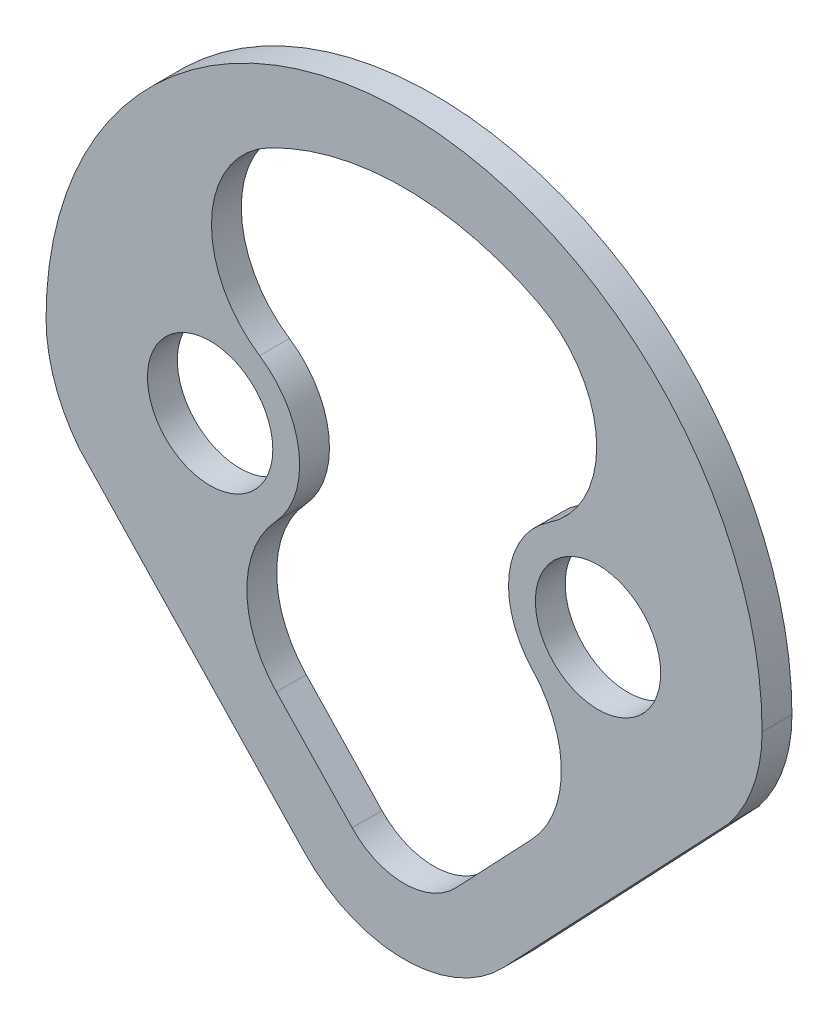
ISO-10303-21;
HEADER;
FILE_DESCRIPTION(('STEP AP214'),'2;1');
FILE_NAME('part.step','',(''),(''),'','','');
FILE_SCHEMA(('AUTOMOTIVE_DESIGN { 1 0 10303 214 1 1 1 1 }'));
ENDSEC;
DATA;
#1=APPLICATION_CONTEXT('core data for automotive mechanical design processes');
#2=APPLICATION_PROTOCOL_DEFINITION('international standard','automotive_design',2000,#1);
#3=PRODUCT_CONTEXT('',#1,'mechanical');
#4=PRODUCT('Part','Part','',(#3));
#5=PRODUCT_RELATED_PRODUCT_CATEGORY('part','',(#4));
#6=PRODUCT_DEFINITION_FORMATION('','',#4);
#7=PRODUCT_DEFINITION_CONTEXT('part definition',#1,'design');
#8=PRODUCT_DEFINITION('design','',#6,#7);
#9=PRODUCT_DEFINITION_SHAPE('','',#8);
#10=(LENGTH_UNIT() NAMED_UNIT(*) SI_UNIT(.MILLI.,.METRE.));
#11=(NAMED_UNIT(*) PLANE_ANGLE_UNIT() SI_UNIT($,.RADIAN.));
#12=(NAMED_UNIT(*) SI_UNIT($,.STERADIAN.) SOLID_ANGLE_UNIT());
#13=UNCERTAINTY_MEASURE_WITH_UNIT(LENGTH_MEASURE(1.E-05),#10,'distance_accuracy_value','');
#14=(GEOMETRIC_REPRESENTATION_CONTEXT(3) GLOBAL_UNCERTAINTY_ASSIGNED_CONTEXT((#13)) GLOBAL_UNIT_ASSIGNED_CONTEXT((#10,
#11,#12)) REPRESENTATION_CONTEXT('',''));
#15=CARTESIAN_POINT('',(0.,0.,0.));
#16=DIRECTION('',(0.,0.,1.));
#17=DIRECTION('',(1.,0.,0.));
#18=AXIS2_PLACEMENT_3D('',#15,#16,#17);
#19=CARTESIAN_POINT('',(14.2807692307692,67.5147166108887,5.));
#20=DIRECTION('',(0.,0.,-1.));
#21=DIRECTION('',(-1.,0.,0.));
#22=AXIS2_PLACEMENT_3D('',#19,#20,#21);
#23=CYLINDRICAL_SURFACE('',#22,18.);
#24=CARTESIAN_POINT('',(14.2807692307692,67.5147166108887,0.));
#25=DIRECTION('',(0.,0.,1.));
#26=DIRECTION('',(1.,0.,0.));
#27=AXIS2_PLACEMENT_3D('',#24,#25,#26);
#28=CIRCLE('',#27,18.);
#29=CARTESIAN_POINT('',(24.2185314685314,52.5066893685858,0.));
#30=VERTEX_POINT('',#29);
#31=CARTESIAN_POINT('',(22.5728287841191,83.4910036752757,0.));
#32=VERTEX_POINT('',#31);
#33=EDGE_CURVE('E254',#30,#32,#28,.T.);
#34=ORIENTED_EDGE('',*,*,#33,.F.);
#35=DIRECTION('',(0.,0.,-1.));
#36=VECTOR('',#35,1.);
#37=CARTESIAN_POINT('',(24.2185314685314,52.5066893685858,5.));
#38=LINE('',#37,#36);
#39=CARTESIAN_POINT('',(24.2185314685314,52.5066893685858,5.));
#40=VERTEX_POINT('',#39);
#41=EDGE_CURVE('E11',#40,#30,#38,.T.);
#42=ORIENTED_EDGE('',*,*,#41,.F.);
#43=CARTESIAN_POINT('',(14.2807692307692,67.5147166108887,5.));
#44=DIRECTION('',(0.,0.,1.));
#45=DIRECTION('',(1.,0.,0.));
#46=AXIS2_PLACEMENT_3D('',#43,#44,#45);
#47=CIRCLE('',#46,18.);
#48=CARTESIAN_POINT('',(22.5728287841191,83.4910036752757,5.));
#49=VERTEX_POINT('',#48);
#50=EDGE_CURVE('E288',#40,#49,#47,.T.);
#51=ORIENTED_EDGE('',*,*,#50,.T.);
#52=DIRECTION('',(0.,0.,-1.));
#53=VECTOR('',#52,1.);
#54=CARTESIAN_POINT('',(22.5728287841191,83.4910036752757,5.));
#55=LINE('',#54,#53);
#56=EDGE_CURVE('E64',#49,#32,#55,.T.);
#57=ORIENTED_EDGE('',*,*,#56,.T.);
#58=EDGE_LOOP('',(#34,#42,#51,#57));
#59=FACE_BOUND('',#58,.T.);
#60=ADVANCED_FACE('F43',(#59),#23,.F.);
#61=CARTESIAN_POINT('',(32.5,40.,5.));
#62=DIRECTION('',(0.,0.,-1.));
#63=DIRECTION('',(-1.,0.,0.));
#64=AXIS2_PLACEMENT_3D('',#61,#62,#63);
#65=CYLINDRICAL_SURFACE('',#64,15.);
#66=CARTESIAN_POINT('',(32.5,40.,0.));
#67=DIRECTION('',(0.,0.,1.));
#68=DIRECTION('',(1.,0.,0.));
#69=AXIS2_PLACEMENT_3D('',#66,#67,#68);
#70=CIRCLE('',#69,15.);
#71=CARTESIAN_POINT('',(21.523623247723,29.7765390697634,0.));
#72=VERTEX_POINT('',#71);
#73=EDGE_CURVE('E249',#72,#30,#70,.F.);
#74=ORIENTED_EDGE('',*,*,#73,.F.);
#75=DIRECTION('',(0.,0.,-1.));
#76=VECTOR('',#75,1.);
#77=CARTESIAN_POINT('',(21.523623247723,29.7765390697634,5.));
#78=LINE('',#77,#76);
#79=CARTESIAN_POINT('',(21.523623247723,29.7765390697634,5.));
#80=VERTEX_POINT('',#79);
#81=EDGE_CURVE('E52',#80,#72,#78,.T.);
#82=ORIENTED_EDGE('',*,*,#81,.F.);
#83=CARTESIAN_POINT('',(32.5,40.,5.));
#84=DIRECTION('',(0.,0.,1.));
#85=DIRECTION('',(1.,0.,0.));
#86=AXIS2_PLACEMENT_3D('',#83,#84,#85);
#87=CIRCLE('',#86,15.);
#88=EDGE_CURVE('E289',#80,#40,#87,.F.);
#89=ORIENTED_EDGE('',*,*,#88,.T.);
#90=ORIENTED_EDGE('',*,*,#41,.T.);
#91=EDGE_LOOP('',(#74,#82,#89,#90));
#92=FACE_BOUND('',#91,.T.);
#93=ADVANCED_FACE('F336',(#92),#65,.T.);
#94=CARTESIAN_POINT('',(8.35197114499067,17.5083859534796,5.));
#95=DIRECTION('',(0.,0.,-1.));
#96=DIRECTION('',(-1.,0.,0.));
#97=AXIS2_PLACEMENT_3D('',#94,#95,#96);
#98=CYLINDRICAL_SURFACE('',#97,18.);
#99=CARTESIAN_POINT('',(8.35197114499067,17.5083859534796,0.));
#100=DIRECTION('',(0.,0.,1.));
#101=DIRECTION('',(1.,0.,0.));
#102=AXIS2_PLACEMENT_3D('',#99,#100,#101);
#103=CIRCLE('',#102,18.);
#104=CARTESIAN_POINT('',(21.4044588240581,5.11352551103031,0.));
#105=VERTEX_POINT('',#104);
#106=EDGE_CURVE('E247',#105,#72,#103,.T.);
#107=ORIENTED_EDGE('',*,*,#106,.F.);
#108=DIRECTION('',(0.,0.,-1.));
#109=VECTOR('',#108,1.);
#110=CARTESIAN_POINT('',(21.4044588240581,5.11352551103031,5.));
#111=LINE('',#110,#109);
#112=CARTESIAN_POINT('',(21.4044588240581,5.11352551103031,5.));
#113=VERTEX_POINT('',#112);
#114=EDGE_CURVE('E196',#113,#105,#111,.T.);
#115=ORIENTED_EDGE('',*,*,#114,.F.);
#116=CARTESIAN_POINT('',(8.35197114499067,17.5083859534796,5.));
#117=DIRECTION('',(0.,0.,1.));
#118=DIRECTION('',(1.,0.,0.));
#119=AXIS2_PLACEMENT_3D('',#116,#117,#118);
#120=CIRCLE('',#119,18.);
#121=EDGE_CURVE('E281',#113,#80,#120,.T.);
#122=ORIENTED_EDGE('',*,*,#121,.T.);
#123=ORIENTED_EDGE('',*,*,#81,.T.);
#124=EDGE_LOOP('',(#107,#115,#122,#123));
#125=FACE_BOUND('',#124,.T.);
#126=ADVANCED_FACE('F345',(#125),#98,.F.);
#127=CARTESIAN_POINT('',(8.7016584527116,-8.26324029496615,5.));
#128=DIRECTION('',(0.725138204392635,-0.688603357913847,0.));
#129=DIRECTION('',(0.688603357913847,0.725138204392635,0.));
#130=AXIS2_PLACEMENT_3D('',#127,#128,#129);
#131=PLANE('',#130);
#132=DIRECTION('',(-0.688603357913847,-0.725138204392635,0.));
#133=VECTOR('',#132,1.);
#134=CARTESIAN_POINT('',(8.7016584527116,-8.26324029496615,0.));
#135=LINE('',#134,#133);
#136=CARTESIAN_POINT('',(8.7016584527116,-8.26324029496615,0.));
#137=VERTEX_POINT('',#136);
#138=EDGE_CURVE('E245',#105,#137,#135,.T.);
#139=ORIENTED_EDGE('',*,*,#138,.T.);
#140=DIRECTION('',(0.,0.,-1.));
#141=VECTOR('',#140,1.);
#142=CARTESIAN_POINT('',(8.7016584527116,-8.26324029496615,5.));
#143=LINE('',#142,#141);
#144=CARTESIAN_POINT('',(8.7016584527116,-8.26324029496615,5.));
#145=VERTEX_POINT('',#144);
#146=EDGE_CURVE('E199',#145,#137,#143,.T.);
#147=ORIENTED_EDGE('',*,*,#146,.F.);
#148=DIRECTION('',(-0.688603357913847,-0.725138204392635,0.));
#149=VECTOR('',#148,1.);
#150=CARTESIAN_POINT('',(8.7016584527116,-8.26324029496615,5.));
#151=LINE('',#150,#149);
#152=EDGE_CURVE('E285',#113,#145,#151,.T.);
#153=ORIENTED_EDGE('',*,*,#152,.F.);
#154=ORIENTED_EDGE('',*,*,#114,.T.);
#155=EDGE_LOOP('',(#139,#147,#153,#154));
#156=FACE_BOUND('',#155,.T.);
#157=ADVANCED_FACE('F371',(#156),#131,.F.);
#158=CARTESIAN_POINT('',(0.,0.,5.));
#159=DIRECTION('',(0.,0.,-1.));
#160=DIRECTION('',(-1.,0.,0.));
#161=AXIS2_PLACEMENT_3D('',#158,#159,#160);
#162=CYLINDRICAL_SURFACE('',#161,12.);
#163=CARTESIAN_POINT('',(0.,0.,0.));
#164=DIRECTION('',(0.,0.,1.));
#165=DIRECTION('',(1.,0.,0.));
#166=AXIS2_PLACEMENT_3D('',#163,#164,#165);
#167=CIRCLE('',#166,12.);
#168=CARTESIAN_POINT('',(-8.70165845271161,-8.26324029496615,0.));
#169=VERTEX_POINT('',#168);
#170=EDGE_CURVE('E238',#169,#137,#167,.T.);
#171=ORIENTED_EDGE('',*,*,#170,.F.);
#172=DIRECTION('',(0.,0.,-1.));
#173=VECTOR('',#172,1.);
#174=CARTESIAN_POINT('',(-8.70165845271161,-8.26324029496615,5.));
#175=LINE('',#174,#173);
#176=CARTESIAN_POINT('',(-8.70165845271161,-8.26324029496615,5.));
#177=VERTEX_POINT('',#176);
#178=EDGE_CURVE('E193',#177,#169,#175,.T.);
#179=ORIENTED_EDGE('',*,*,#178,.F.);
#180=CARTESIAN_POINT('',(0.,0.,5.));
#181=DIRECTION('',(0.,0.,1.));
#182=DIRECTION('',(1.,0.,0.));
#183=AXIS2_PLACEMENT_3D('',#180,#181,#182);
#184=CIRCLE('',#183,12.);
#185=EDGE_CURVE('E278',#177,#145,#184,.T.);
#186=ORIENTED_EDGE('',*,*,#185,.T.);
#187=ORIENTED_EDGE('',*,*,#146,.T.);
#188=EDGE_LOOP('',(#171,#179,#186,#187));
#189=FACE_BOUND('',#188,.T.);
#190=ADVANCED_FACE('F369',(#189),#162,.F.);
#191=CARTESIAN_POINT('',(-8.70165845271162,-8.26324029496615,5.));
#192=DIRECTION('',(0.725138204392635,0.688603357913846,0.));
#193=DIRECTION('',(-0.688603357913846,0.725138204392635,0.));
#194=AXIS2_PLACEMENT_3D('',#191,#192,#193);
#195=PLANE('',#194);
#196=DIRECTION('',(0.688603357913846,-0.725138204392635,0.));
#197=VECTOR('',#196,1.);
#198=CARTESIAN_POINT('',(-8.70165845271162,-8.26324029496615,0.));
#199=LINE('',#198,#197);
#200=CARTESIAN_POINT('',(-21.4044588240581,5.11352551103031,0.));
#201=VERTEX_POINT('',#200);
#202=EDGE_CURVE('E240',#201,#169,#199,.T.);
#203=ORIENTED_EDGE('',*,*,#202,.F.);
#204=DIRECTION('',(0.,0.,-1.));
#205=VECTOR('',#204,1.);
#206=CARTESIAN_POINT('',(-21.4044588240581,5.11352551103031,5.));
#207=LINE('',#206,#205);
#208=CARTESIAN_POINT('',(-21.4044588240581,5.11352551103031,5.));
#209=VERTEX_POINT('',#208);
#210=EDGE_CURVE('E188',#209,#201,#207,.T.);
#211=ORIENTED_EDGE('',*,*,#210,.F.);
#212=DIRECTION('',(0.688603357913846,-0.725138204392635,0.));
#213=VECTOR('',#212,1.);
#214=CARTESIAN_POINT('',(-8.70165845271162,-8.26324029496615,5.));
#215=LINE('',#214,#213);
#216=EDGE_CURVE('E276',#209,#177,#215,.T.);
#217=ORIENTED_EDGE('',*,*,#216,.T.);
#218=ORIENTED_EDGE('',*,*,#178,.T.);
#219=EDGE_LOOP('',(#203,#211,#217,#218));
#220=FACE_BOUND('',#219,.T.);
#221=ADVANCED_FACE('F366',(#220),#195,.T.);
#222=CARTESIAN_POINT('',(-8.35197114499067,17.5083859534796,5.));
#223=DIRECTION('',(0.,0.,-1.));
#224=DIRECTION('',(-1.,0.,0.));
#225=AXIS2_PLACEMENT_3D('',#222,#223,#224);
#226=CYLINDRICAL_SURFACE('',#225,18.);
#227=CARTESIAN_POINT('',(-8.35197114499067,17.5083859534796,0.));
#228=DIRECTION('',(0.,0.,1.));
#229=DIRECTION('',(1.,0.,0.));
#230=AXIS2_PLACEMENT_3D('',#227,#228,#229);
#231=CIRCLE('',#230,18.);
#232=CARTESIAN_POINT('',(-21.523623247723,29.7765390697634,0.));
#233=VERTEX_POINT('',#232);
#234=EDGE_CURVE('E233',#201,#233,#231,.F.);
#235=ORIENTED_EDGE('',*,*,#234,.T.);
#236=DIRECTION('',(0.,0.,-1.));
#237=VECTOR('',#236,1.);
#238=CARTESIAN_POINT('',(-21.523623247723,29.7765390697634,5.));
#239=LINE('',#238,#237);
#240=CARTESIAN_POINT('',(-21.523623247723,29.7765390697634,5.));
#241=VERTEX_POINT('',#240);
#242=EDGE_CURVE('E190',#241,#233,#239,.T.);
#243=ORIENTED_EDGE('',*,*,#242,.F.);
#244=CARTESIAN_POINT('',(-8.35197114499067,17.5083859534796,5.));
#245=DIRECTION('',(0.,0.,1.));
#246=DIRECTION('',(1.,0.,0.));
#247=AXIS2_PLACEMENT_3D('',#244,#245,#246);
#248=CIRCLE('',#247,18.);
#249=EDGE_CURVE('E179',#209,#241,#248,.F.);
#250=ORIENTED_EDGE('',*,*,#249,.F.);
#251=ORIENTED_EDGE('',*,*,#210,.T.);
#252=EDGE_LOOP('',(#235,#243,#250,#251));
#253=FACE_BOUND('',#252,.T.);
#254=ADVANCED_FACE('F363',(#253),#226,.F.);
#255=CARTESIAN_POINT('',(-32.5,40.,5.));
#256=DIRECTION('',(0.,0.,-1.));
#257=DIRECTION('',(-1.,0.,0.));
#258=AXIS2_PLACEMENT_3D('',#255,#256,#257);
#259=CYLINDRICAL_SURFACE('',#258,15.);
#260=CARTESIAN_POINT('',(-32.5,40.,0.));
#261=DIRECTION('',(0.,0.,1.));
#262=DIRECTION('',(1.,0.,0.));
#263=AXIS2_PLACEMENT_3D('',#260,#261,#262);
#264=CIRCLE('',#263,15.);
#265=CARTESIAN_POINT('',(-24.2185314685315,52.5066893685858,0.));
#266=VERTEX_POINT('',#265);
#267=EDGE_CURVE('E186',#233,#266,#264,.T.);
#268=ORIENTED_EDGE('',*,*,#267,.T.);
#269=DIRECTION('',(0.,0.,-1.));
#270=VECTOR('',#269,1.);
#271=CARTESIAN_POINT('',(-24.2185314685315,52.5066893685858,5.));
#272=LINE('',#271,#270);
#273=CARTESIAN_POINT('',(-24.2185314685315,52.5066893685858,5.));
#274=VERTEX_POINT('',#273);
#275=EDGE_CURVE('E167',#274,#266,#272,.T.);
#276=ORIENTED_EDGE('',*,*,#275,.F.);
#277=CARTESIAN_POINT('',(-32.5,40.,5.));
#278=DIRECTION('',(0.,0.,1.));
#279=DIRECTION('',(1.,0.,0.));
#280=AXIS2_PLACEMENT_3D('',#277,#278,#279);
#281=CIRCLE('',#280,15.);
#282=EDGE_CURVE('E175',#241,#274,#281,.T.);
#283=ORIENTED_EDGE('',*,*,#282,.F.);
#284=ORIENTED_EDGE('',*,*,#242,.T.);
#285=EDGE_LOOP('',(#268,#276,#283,#284));
#286=FACE_BOUND('',#285,.T.);
#287=ADVANCED_FACE('F184',(#286),#259,.T.);
#288=CARTESIAN_POINT('',(-14.2807692307693,67.5147166108887,5.));
#289=DIRECTION('',(0.,0.,-1.));
#290=DIRECTION('',(-1.,0.,0.));
#291=AXIS2_PLACEMENT_3D('',#288,#289,#290);
#292=CYLINDRICAL_SURFACE('',#291,18.);
#293=CARTESIAN_POINT('',(-14.2807692307693,67.5147166108887,0.));
#294=DIRECTION('',(0.,0.,1.));
#295=DIRECTION('',(1.,0.,0.));
#296=AXIS2_PLACEMENT_3D('',#293,#294,#295);
#297=CIRCLE('',#296,18.);
#298=CARTESIAN_POINT('',(-22.5728287841191,83.4910036752757,0.));
#299=VERTEX_POINT('',#298);
#300=EDGE_CURVE('E231',#266,#299,#297,.F.);
#301=ORIENTED_EDGE('',*,*,#300,.T.);
#302=DIRECTION('',(0.,0.,-1.));
#303=VECTOR('',#302,1.);
#304=CARTESIAN_POINT('',(-22.5728287841191,83.4910036752757,5.));
#305=LINE('',#304,#303);
#306=CARTESIAN_POINT('',(-22.5728287841191,83.4910036752757,5.));
#307=VERTEX_POINT('',#306);
#308=EDGE_CURVE('E115',#307,#299,#305,.T.);
#309=ORIENTED_EDGE('',*,*,#308,.F.);
#310=CARTESIAN_POINT('',(-14.2807692307693,67.5147166108887,5.));
#311=DIRECTION('',(0.,0.,1.));
#312=DIRECTION('',(1.,0.,0.));
#313=AXIS2_PLACEMENT_3D('',#310,#311,#312);
#314=CIRCLE('',#313,18.);
#315=EDGE_CURVE('E165',#274,#307,#314,.F.);
#316=ORIENTED_EDGE('',*,*,#315,.F.);
#317=ORIENTED_EDGE('',*,*,#275,.T.);
#318=EDGE_LOOP('',(#301,#309,#316,#317));
#319=FACE_BOUND('',#318,.T.);
#320=ADVANCED_FACE('F163',(#319),#292,.F.);
#321=CARTESIAN_POINT('',(34.,40.,5.));
#322=DIRECTION('',(0.,0.,-1.));
#323=DIRECTION('',(-1.,0.,0.));
#324=AXIS2_PLACEMENT_3D('',#321,#322,#323);
#325=CYLINDRICAL_SURFACE('',#324,26.);
#326=CARTESIAN_POINT('',(34.,40.,0.));
#327=DIRECTION('',(0.,0.,1.));
#328=DIRECTION('',(1.,0.,0.));
#329=AXIS2_PLACEMENT_3D('',#326,#327,#328);
#330=CIRCLE('',#329,26.);
#331=CARTESIAN_POINT('',(60.,40.,0.));
#332=VERTEX_POINT('',#331);
#333=CARTESIAN_POINT('',(54.4227834779159,23.9093221083087,0.));
#334=VERTEX_POINT('',#333);
#335=EDGE_CURVE('E266',#332,#334,#330,.F.);
#336=ORIENTED_EDGE('',*,*,#335,.F.);
#337=DIRECTION('',(0.,0.,-1.));
#338=VECTOR('',#337,1.);
#339=CARTESIAN_POINT('',(60.,40.,5.));
#340=LINE('',#339,#338);
#341=CARTESIAN_POINT('',(60.,40.,5.));
#342=VERTEX_POINT('',#341);
#343=EDGE_CURVE('E50',#342,#332,#340,.T.);
#344=ORIENTED_EDGE('',*,*,#343,.F.);
#345=CARTESIAN_POINT('',(34.,40.,5.));
#346=DIRECTION('',(0.,0.,1.));
#347=DIRECTION('',(1.,0.,0.));
#348=AXIS2_PLACEMENT_3D('',#345,#346,#347);
#349=CIRCLE('',#348,26.);
#350=CARTESIAN_POINT('',(54.4227834779159,23.9093221083087,5.));
#351=VERTEX_POINT('',#350);
#352=EDGE_CURVE('E222',#342,#351,#349,.F.);
#353=ORIENTED_EDGE('',*,*,#352,.T.);
#354=DIRECTION('',(0.,0.,-1.));
#355=VECTOR('',#354,1.);
#356=CARTESIAN_POINT('',(54.4227834779159,23.9093221083087,5.));
#357=LINE('',#356,#355);
#358=EDGE_CURVE('E205',#351,#334,#357,.T.);
#359=ORIENTED_EDGE('',*,*,#358,.T.);
#360=EDGE_LOOP('',(#336,#344,#353,#359));
#361=FACE_BOUND('',#360,.T.);
#362=ADVANCED_FACE('F44',(#361),#325,.T.);
#363=CARTESIAN_POINT('',(0.,40.,5.));
#364=DIRECTION('',(0.,0.,-1.));
#365=DIRECTION('',(-1.,0.,0.));
#366=AXIS2_PLACEMENT_3D('',#363,#364,#365);
#367=CYLINDRICAL_SURFACE('',#366,60.);
#368=CARTESIAN_POINT('',(0.,40.,0.));
#369=DIRECTION('',(0.,0.,1.));
#370=DIRECTION('',(1.,0.,0.));
#371=AXIS2_PLACEMENT_3D('',#368,#369,#370);
#372=CIRCLE('',#371,60.);
#373=CARTESIAN_POINT('',(-60.,40.,0.));
#374=VERTEX_POINT('',#373);
#375=EDGE_CURVE('E264',#332,#374,#372,.T.);
#376=ORIENTED_EDGE('',*,*,#375,.T.);
#377=DIRECTION('',(0.,0.,-1.));
#378=VECTOR('',#377,1.);
#379=CARTESIAN_POINT('',(-60.,40.,5.));
#380=LINE('',#379,#378);
#381=CARTESIAN_POINT('',(-60.,40.,5.));
#382=VERTEX_POINT('',#381);
#383=EDGE_CURVE('E212',#382,#374,#380,.T.);
#384=ORIENTED_EDGE('',*,*,#383,.F.);
#385=CARTESIAN_POINT('',(0.,40.,5.));
#386=DIRECTION('',(0.,0.,1.));
#387=DIRECTION('',(1.,0.,0.));
#388=AXIS2_PLACEMENT_3D('',#385,#386,#387);
#389=CIRCLE('',#388,60.);
#390=EDGE_CURVE('E303',#342,#382,#389,.T.);
#391=ORIENTED_EDGE('',*,*,#390,.F.);
#392=ORIENTED_EDGE('',*,*,#343,.T.);
#393=EDGE_LOOP('',(#376,#384,#391,#392));
#394=FACE_BOUND('',#393,.T.);
#395=ADVANCED_FACE('F316',(#394),#367,.T.);
#396=CARTESIAN_POINT('',(-34.,40.,5.));
#397=DIRECTION('',(0.,0.,-1.));
#398=DIRECTION('',(-1.,0.,0.));
#399=AXIS2_PLACEMENT_3D('',#396,#397,#398);
#400=CYLINDRICAL_SURFACE('',#399,26.);
#401=CARTESIAN_POINT('',(-34.,40.,0.));
#402=DIRECTION('',(0.,0.,1.));
#403=DIRECTION('',(1.,0.,0.));
#404=AXIS2_PLACEMENT_3D('',#401,#402,#403);
#405=CIRCLE('',#404,26.);
#406=CARTESIAN_POINT('',(-54.4227834779159,23.9093221083087,0.));
#407=VERTEX_POINT('',#406);
#408=EDGE_CURVE('E265',#374,#407,#405,.T.);
#409=ORIENTED_EDGE('',*,*,#408,.T.);
#410=DIRECTION('',(0.,0.,-1.));
#411=VECTOR('',#410,1.);
#412=CARTESIAN_POINT('',(-54.4227834779159,23.9093221083087,5.));
#413=LINE('',#412,#411);
#414=CARTESIAN_POINT('',(-54.4227834779159,23.9093221083087,5.));
#415=VERTEX_POINT('',#414);
#416=EDGE_CURVE('E208',#415,#407,#413,.T.);
#417=ORIENTED_EDGE('',*,*,#416,.F.);
#418=CARTESIAN_POINT('',(-34.,40.,5.));
#419=DIRECTION('',(0.,0.,1.));
#420=DIRECTION('',(1.,0.,0.));
#421=AXIS2_PLACEMENT_3D('',#418,#419,#420);
#422=CIRCLE('',#421,26.);
#423=EDGE_CURVE('E296',#382,#415,#422,.T.);
#424=ORIENTED_EDGE('',*,*,#423,.F.);
#425=ORIENTED_EDGE('',*,*,#383,.T.);
#426=EDGE_LOOP('',(#409,#417,#424,#425));
#427=FACE_BOUND('',#426,.T.);
#428=ADVANCED_FACE('F318',(#427),#400,.T.);
#429=CARTESIAN_POINT('',(-16.6781787010306,-15.8378772320185,5.));
#430=DIRECTION('',(0.725138204392635,0.688603357913847,0.));
#431=DIRECTION('',(-0.688603357913847,0.725138204392635,0.));
#432=AXIS2_PLACEMENT_3D('',#429,#430,#431);
#433=PLANE('',#432);
#434=DIRECTION('',(0.688603357913847,-0.725138204392635,0.));
#435=VECTOR('',#434,1.);
#436=CARTESIAN_POINT('',(-16.6781787010306,-15.8378772320185,0.));
#437=LINE('',#436,#435);
#438=CARTESIAN_POINT('',(-16.6781787010306,-15.8378772320185,0.));
#439=VERTEX_POINT('',#438);
#440=EDGE_CURVE('E259',#407,#439,#437,.T.);
#441=ORIENTED_EDGE('',*,*,#440,.T.);
#442=DIRECTION('',(0.,0.,-1.));
#443=VECTOR('',#442,1.);
#444=CARTESIAN_POINT('',(-16.6781787010306,-15.8378772320185,5.));
#445=LINE('',#444,#443);
#446=CARTESIAN_POINT('',(-16.6781787010306,-15.8378772320185,5.));
#447=VERTEX_POINT('',#446);
#448=EDGE_CURVE('E209',#447,#439,#445,.T.);
#449=ORIENTED_EDGE('',*,*,#448,.F.);
#450=DIRECTION('',(0.688603357913847,-0.725138204392635,0.));
#451=VECTOR('',#450,1.);
#452=CARTESIAN_POINT('',(-16.6781787010306,-15.8378772320185,5.));
#453=LINE('',#452,#451);
#454=EDGE_CURVE('E299',#415,#447,#453,.T.);
#455=ORIENTED_EDGE('',*,*,#454,.F.);
#456=ORIENTED_EDGE('',*,*,#416,.T.);
#457=EDGE_LOOP('',(#441,#449,#455,#456));
#458=FACE_BOUND('',#457,.T.);
#459=ADVANCED_FACE('F325',(#458),#433,.F.);
#460=CARTESIAN_POINT('',(0.,0.,5.));
#461=DIRECTION('',(0.,0.,-1.));
#462=DIRECTION('',(-1.,0.,0.));
#463=AXIS2_PLACEMENT_3D('',#460,#461,#462);
#464=CYLINDRICAL_SURFACE('',#463,23.);
#465=CARTESIAN_POINT('',(0.,0.,0.));
#466=DIRECTION('',(0.,0.,1.));
#467=DIRECTION('',(1.,0.,0.));
#468=AXIS2_PLACEMENT_3D('',#465,#466,#467);
#469=CIRCLE('',#468,23.);
#470=CARTESIAN_POINT('',(16.6781787010306,-15.8378772320185,0.));
#471=VERTEX_POINT('',#470);
#472=EDGE_CURVE('E257',#439,#471,#469,.T.);
#473=ORIENTED_EDGE('',*,*,#472,.T.);
#474=DIRECTION('',(0.,0.,-1.));
#475=VECTOR('',#474,1.);
#476=CARTESIAN_POINT('',(16.6781787010306,-15.8378772320185,5.));
#477=LINE('',#476,#475);
#478=CARTESIAN_POINT('',(16.6781787010306,-15.8378772320185,5.));
#479=VERTEX_POINT('',#478);
#480=EDGE_CURVE('E204',#479,#471,#477,.T.);
#481=ORIENTED_EDGE('',*,*,#480,.F.);
#482=CARTESIAN_POINT('',(0.,0.,5.));
#483=DIRECTION('',(0.,0.,1.));
#484=DIRECTION('',(1.,0.,0.));
#485=AXIS2_PLACEMENT_3D('',#482,#483,#484);
#486=CIRCLE('',#485,23.);
#487=EDGE_CURVE('E293',#447,#479,#486,.T.);
#488=ORIENTED_EDGE('',*,*,#487,.F.);
#489=ORIENTED_EDGE('',*,*,#448,.T.);
#490=EDGE_LOOP('',(#473,#481,#488,#489));
#491=FACE_BOUND('',#490,.T.);
#492=ADVANCED_FACE('F323',(#491),#464,.T.);
#493=CARTESIAN_POINT('',(-32.5,40.,5.));
#494=DIRECTION('',(0.,0.,-1.));
#495=DIRECTION('',(-1.,0.,0.));
#496=AXIS2_PLACEMENT_3D('',#493,#494,#495);
#497=CYLINDRICAL_SURFACE('',#496,10.5);
#498=CARTESIAN_POINT('',(-32.5,40.,5.));
#499=DIRECTION('',(0.,0.,1.));
#500=DIRECTION('',(1.,0.,0.));
#501=AXIS2_PLACEMENT_3D('',#498,#499,#500);
#502=CIRCLE('',#501,10.5);
#503=CARTESIAN_POINT('',(-22.,40.,5.));
#504=VERTEX_POINT('',#503);
#505=EDGE_CURVE('E271',#504,#504,#502,.T.);
#506=ORIENTED_EDGE('',*,*,#505,.T.);
#507=EDGE_LOOP('',(#506));
#508=FACE_BOUND('',#507,.T.);
#509=CARTESIAN_POINT('',(-32.5,40.,0.));
#510=DIRECTION('',(0.,0.,1.));
#511=DIRECTION('',(1.,0.,0.));
#512=AXIS2_PLACEMENT_3D('',#509,#510,#511);
#513=CIRCLE('',#512,10.5);
#514=CARTESIAN_POINT('',(-22.,40.,0.));
#515=VERTEX_POINT('',#514);
#516=EDGE_CURVE('E224',#515,#515,#513,.T.);
#517=ORIENTED_EDGE('',*,*,#516,.F.);
#518=EDGE_LOOP('',(#517));
#519=FACE_BOUND('',#518,.T.);
#520=ADVANCED_FACE('F327',(#508,#519),#497,.F.);
#521=CARTESIAN_POINT('',(0.,40.,5.));
#522=DIRECTION('',(0.,0.,-1.));
#523=DIRECTION('',(-1.,0.,0.));
#524=AXIS2_PLACEMENT_3D('',#521,#522,#523);
#525=CYLINDRICAL_SURFACE('',#524,49.);
#526=CARTESIAN_POINT('',(0.,40.,0.));
#527=DIRECTION('',(0.,0.,1.));
#528=DIRECTION('',(1.,0.,0.));
#529=AXIS2_PLACEMENT_3D('',#526,#527,#528);
#530=CIRCLE('',#529,49.);
#531=EDGE_CURVE('E228',#32,#299,#530,.T.);
#532=ORIENTED_EDGE('',*,*,#531,.F.);
#533=ORIENTED_EDGE('',*,*,#56,.F.);
#534=CARTESIAN_POINT('',(0.,40.,5.));
#535=DIRECTION('',(0.,0.,1.));
#536=DIRECTION('',(1.,0.,0.));
#537=AXIS2_PLACEMENT_3D('',#534,#535,#536);
#538=CIRCLE('',#537,49.);
#539=EDGE_CURVE('E173',#49,#307,#538,.T.);
#540=ORIENTED_EDGE('',*,*,#539,.T.);
#541=ORIENTED_EDGE('',*,*,#308,.T.);
#542=EDGE_LOOP('',(#532,#533,#540,#541));
#543=FACE_BOUND('',#542,.T.);
#544=ADVANCED_FACE('F334',(#543),#525,.F.);
#545=CARTESIAN_POINT('',(16.6781787010306,-15.8378772320185,5.));
#546=DIRECTION('',(0.725138204392635,-0.688603357913846,0.));
#547=DIRECTION('',(0.688603357913846,0.725138204392635,0.));
#548=AXIS2_PLACEMENT_3D('',#545,#546,#547);
#549=PLANE('',#548);
#550=DIRECTION('',(-0.688603357913846,-0.725138204392635,0.));
#551=VECTOR('',#550,1.);
#552=CARTESIAN_POINT('',(16.6781787010306,-15.8378772320185,0.));
#553=LINE('',#552,#551);
#554=EDGE_CURVE('E251',#334,#471,#553,.T.);
#555=ORIENTED_EDGE('',*,*,#554,.F.);
#556=ORIENTED_EDGE('',*,*,#358,.F.);
#557=DIRECTION('',(-0.688603357913846,-0.725138204392635,0.));
#558=VECTOR('',#557,1.);
#559=CARTESIAN_POINT('',(16.6781787010306,-15.8378772320185,5.));
#560=LINE('',#559,#558);
#561=EDGE_CURVE('E295',#351,#479,#560,.T.);
#562=ORIENTED_EDGE('',*,*,#561,.T.);
#563=ORIENTED_EDGE('',*,*,#480,.T.);
#564=EDGE_LOOP('',(#555,#556,#562,#563));
#565=FACE_BOUND('',#564,.T.);
#566=ADVANCED_FACE('F307',(#565),#549,.T.);
#567=CARTESIAN_POINT('',(32.5,40.,5.));
#568=DIRECTION('',(0.,0.,-1.));
#569=DIRECTION('',(-1.,0.,0.));
#570=AXIS2_PLACEMENT_3D('',#567,#568,#569);
#571=CYLINDRICAL_SURFACE('',#570,10.5);
#572=CARTESIAN_POINT('',(32.5,40.,5.));
#573=DIRECTION('',(0.,0.,1.));
#574=DIRECTION('',(1.,0.,0.));
#575=AXIS2_PLACEMENT_3D('',#572,#573,#574);
#576=CIRCLE('',#575,10.5);
#577=CARTESIAN_POINT('',(43.,40.,5.));
#578=VERTEX_POINT('',#577);
#579=EDGE_CURVE('E203',#578,#578,#576,.F.);
#580=ORIENTED_EDGE('',*,*,#579,.F.);
#581=EDGE_LOOP('',(#580));
#582=FACE_BOUND('',#581,.T.);
#583=CARTESIAN_POINT('',(32.5,40.,0.));
#584=DIRECTION('',(0.,0.,1.));
#585=DIRECTION('',(1.,0.,0.));
#586=AXIS2_PLACEMENT_3D('',#583,#584,#585);
#587=CIRCLE('',#586,10.5);
#588=CARTESIAN_POINT('',(43.,40.,0.));
#589=VERTEX_POINT('',#588);
#590=EDGE_CURVE('E221',#589,#589,#587,.F.);
#591=ORIENTED_EDGE('',*,*,#590,.T.);
#592=EDGE_LOOP('',(#591));
#593=FACE_BOUND('',#592,.T.);
#594=ADVANCED_FACE('F346',(#582,#593),#571,.F.);
#595=CARTESIAN_POINT('',(0.,0.,5.));
#596=DIRECTION('',(0.,0.,1.));
#597=DIRECTION('',(1.,0.,0.));
#598=AXIS2_PLACEMENT_3D('',#595,#596,#597);
#599=PLANE('',#598);
#600=ORIENTED_EDGE('',*,*,#352,.F.);
#601=ORIENTED_EDGE('',*,*,#390,.T.);
#602=ORIENTED_EDGE('',*,*,#423,.T.);
#603=ORIENTED_EDGE('',*,*,#454,.T.);
#604=ORIENTED_EDGE('',*,*,#487,.T.);
#605=ORIENTED_EDGE('',*,*,#561,.F.);
#606=EDGE_LOOP('',(#600,#601,#602,#603,#604,#605));
#607=FACE_BOUND('',#606,.T.);
#608=ORIENTED_EDGE('',*,*,#50,.F.);
#609=ORIENTED_EDGE('',*,*,#88,.F.);
#610=ORIENTED_EDGE('',*,*,#121,.F.);
#611=ORIENTED_EDGE('',*,*,#152,.T.);
#612=ORIENTED_EDGE('',*,*,#185,.F.);
#613=ORIENTED_EDGE('',*,*,#216,.F.);
#614=ORIENTED_EDGE('',*,*,#249,.T.);
#615=ORIENTED_EDGE('',*,*,#282,.T.);
#616=ORIENTED_EDGE('',*,*,#315,.T.);
#617=ORIENTED_EDGE('',*,*,#539,.F.);
#618=EDGE_LOOP('',(#608,#609,#610,#611,#612,#613,#614,#615,#616,#617));
#619=FACE_BOUND('',#618,.T.);
#620=ORIENTED_EDGE('',*,*,#505,.F.);
#621=EDGE_LOOP('',(#620));
#622=FACE_BOUND('',#621,.T.);
#623=ORIENTED_EDGE('',*,*,#579,.T.);
#624=EDGE_LOOP('',(#623));
#625=FACE_BOUND('',#624,.T.);
#626=ADVANCED_FACE('F176',(#607,#619,#622,#625),#599,.T.);
#627=CARTESIAN_POINT('',(0.,0.,0.));
#628=DIRECTION('',(0.,0.,1.));
#629=DIRECTION('',(1.,0.,0.));
#630=AXIS2_PLACEMENT_3D('',#627,#628,#629);
#631=PLANE('',#630);
#632=ORIENTED_EDGE('',*,*,#335,.T.);
#633=ORIENTED_EDGE('',*,*,#554,.T.);
#634=ORIENTED_EDGE('',*,*,#472,.F.);
#635=ORIENTED_EDGE('',*,*,#440,.F.);
#636=ORIENTED_EDGE('',*,*,#408,.F.);
#637=ORIENTED_EDGE('',*,*,#375,.F.);
#638=EDGE_LOOP('',(#632,#633,#634,#635,#636,#637));
#639=FACE_BOUND('',#638,.T.);
#640=ORIENTED_EDGE('',*,*,#33,.T.);
#641=ORIENTED_EDGE('',*,*,#531,.T.);
#642=ORIENTED_EDGE('',*,*,#300,.F.);
#643=ORIENTED_EDGE('',*,*,#267,.F.);
#644=ORIENTED_EDGE('',*,*,#234,.F.);
#645=ORIENTED_EDGE('',*,*,#202,.T.);
#646=ORIENTED_EDGE('',*,*,#170,.T.);
#647=ORIENTED_EDGE('',*,*,#138,.F.);
#648=ORIENTED_EDGE('',*,*,#106,.T.);
#649=ORIENTED_EDGE('',*,*,#73,.T.);
#650=EDGE_LOOP('',(#640,#641,#642,#643,#644,#645,#646,#647,#648,#649));
#651=FACE_BOUND('',#650,.T.);
#652=ORIENTED_EDGE('',*,*,#516,.T.);
#653=EDGE_LOOP('',(#652));
#654=FACE_BOUND('',#653,.T.);
#655=ORIENTED_EDGE('',*,*,#590,.F.);
#656=EDGE_LOOP('',(#655));
#657=FACE_BOUND('',#656,.T.);
#658=ADVANCED_FACE('F313',(#639,#651,#654,#657),#631,.F.);
#659=CLOSED_SHELL('',(#60,#93,#126,#157,#190,#221,#254,#287,#320,#362,#395,#428,#459,#492,#520,
#544,#566,#594,#626,#658));
#660=MANIFOLD_SOLID_BREP('B2',#659);
#661=ADVANCED_BREP_SHAPE_REPRESENTATION('',(#18,#660),#14);
#662=SHAPE_DEFINITION_REPRESENTATION(#9,#661);
ENDSEC;
END-ISO-10303-21;
